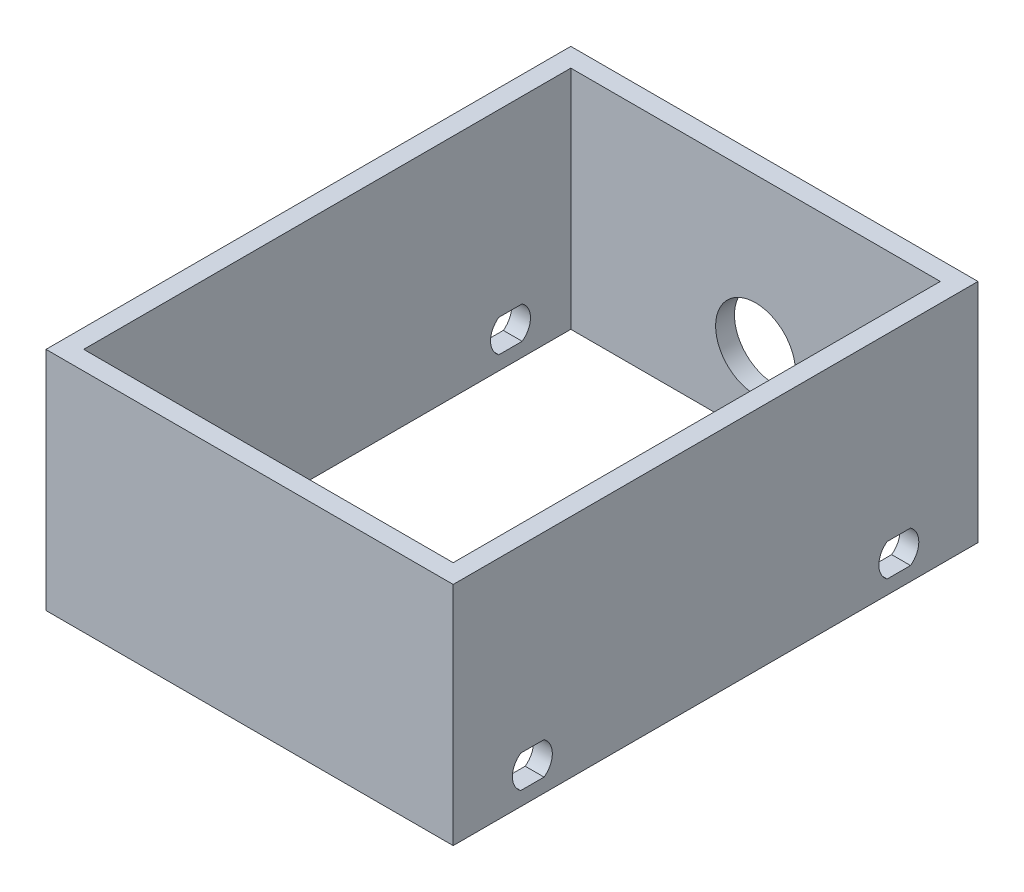
ISO-10303-21;
HEADER;
FILE_DESCRIPTION(('STEP AP214'),'2;1');
FILE_NAME('part.step','',(''),(''),'','','');
FILE_SCHEMA(('AUTOMOTIVE_DESIGN { 1 0 10303 214 1 1 1 1 }'));
ENDSEC;
DATA;
#1=APPLICATION_CONTEXT('core data for automotive mechanical design processes');
#2=APPLICATION_PROTOCOL_DEFINITION('international standard','automotive_design',2000,#1);
#3=PRODUCT_CONTEXT('',#1,'mechanical');
#4=PRODUCT('Part','Part','',(#3));
#5=PRODUCT_RELATED_PRODUCT_CATEGORY('part','',(#4));
#6=PRODUCT_DEFINITION_FORMATION('','',#4);
#7=PRODUCT_DEFINITION_CONTEXT('part definition',#1,'design');
#8=PRODUCT_DEFINITION('design','',#6,#7);
#9=PRODUCT_DEFINITION_SHAPE('','',#8);
#10=(LENGTH_UNIT() NAMED_UNIT(*) SI_UNIT(.MILLI.,.METRE.));
#11=(NAMED_UNIT(*) PLANE_ANGLE_UNIT() SI_UNIT($,.RADIAN.));
#12=(NAMED_UNIT(*) SI_UNIT($,.STERADIAN.) SOLID_ANGLE_UNIT());
#13=UNCERTAINTY_MEASURE_WITH_UNIT(LENGTH_MEASURE(1.E-05),#10,'distance_accuracy_value','');
#14=(GEOMETRIC_REPRESENTATION_CONTEXT(3) GLOBAL_UNCERTAINTY_ASSIGNED_CONTEXT((#13)) GLOBAL_UNIT_ASSIGNED_CONTEXT((#10,
#11,#12)) REPRESENTATION_CONTEXT('',''));
#15=CARTESIAN_POINT('',(0.,0.,0.));
#16=DIRECTION('',(0.,0.,1.));
#17=DIRECTION('',(1.,0.,0.));
#18=AXIS2_PLACEMENT_3D('',#15,#16,#17);
#19=CARTESIAN_POINT('',(27.,20.,-34.8));
#20=DIRECTION('',(0.,0.,1.));
#21=DIRECTION('',(1.,0.,0.));
#22=AXIS2_PLACEMENT_3D('',#19,#20,#21);
#23=PLANE('',#22);
#24=DIRECTION('',(-1.,0.,0.));
#25=VECTOR('',#24,1.);
#26=CARTESIAN_POINT('',(27.,0.,-34.8));
#27=LINE('',#26,#25);
#28=CARTESIAN_POINT('',(27.,0.,-34.8));
#29=VERTEX_POINT('',#28);
#30=CARTESIAN_POINT('',(-27.,0.,-34.8));
#31=VERTEX_POINT('',#30);
#32=EDGE_CURVE('E376',#29,#31,#27,.T.);
#33=ORIENTED_EDGE('',*,*,#32,.T.);
#34=DIRECTION('',(0.,-1.,0.));
#35=VECTOR('',#34,1.);
#36=CARTESIAN_POINT('',(-27.,20.,-34.8));
#37=LINE('',#36,#35);
#38=CARTESIAN_POINT('',(-27.,30.,-34.8));
#39=VERTEX_POINT('',#38);
#40=EDGE_CURVE('E384',#39,#31,#37,.T.);
#41=ORIENTED_EDGE('',*,*,#40,.F.);
#42=DIRECTION('',(-1.,0.,0.));
#43=VECTOR('',#42,1.);
#44=CARTESIAN_POINT('',(27.,30.,-34.8));
#45=LINE('',#44,#43);
#46=CARTESIAN_POINT('',(27.,30.,-34.8));
#47=VERTEX_POINT('',#46);
#48=EDGE_CURVE('E353',#47,#39,#45,.T.);
#49=ORIENTED_EDGE('',*,*,#48,.F.);
#50=DIRECTION('',(0.,-1.,0.));
#51=VECTOR('',#50,1.);
#52=CARTESIAN_POINT('',(27.,20.,-34.8));
#53=LINE('',#52,#51);
#54=EDGE_CURVE('E387',#47,#29,#53,.T.);
#55=ORIENTED_EDGE('',*,*,#54,.T.);
#56=EDGE_LOOP('',(#33,#41,#49,#55));
#57=FACE_BOUND('',#56,.T.);
#58=CARTESIAN_POINT('',(0.,10.,-34.8));
#59=DIRECTION('',(0.,0.,1.));
#60=DIRECTION('',(1.,0.,0.));
#61=AXIS2_PLACEMENT_3D('',#58,#59,#60);
#62=CIRCLE('',#61,5.3);
#63=CARTESIAN_POINT('',(5.3,10.,-34.8));
#64=VERTEX_POINT('',#63);
#65=EDGE_CURVE('E321',#64,#64,#62,.T.);
#66=ORIENTED_EDGE('',*,*,#65,.T.);
#67=EDGE_LOOP('',(#66));
#68=FACE_BOUND('',#67,.T.);
#69=ADVANCED_FACE('F53',(#57,#68),#23,.F.);
#70=CARTESIAN_POINT('',(24.5,-82.4824829888141,-32.3));
#71=DIRECTION('',(0.,0.,-1.));
#72=DIRECTION('',(-1.,0.,0.));
#73=AXIS2_PLACEMENT_3D('',#70,#71,#72);
#74=PLANE('',#73);
#75=DIRECTION('',(-1.,0.,0.));
#76=VECTOR('',#75,1.);
#77=CARTESIAN_POINT('',(24.5,0.,-32.3));
#78=LINE('',#77,#76);
#79=CARTESIAN_POINT('',(24.5,0.,-32.3));
#80=VERTEX_POINT('',#79);
#81=CARTESIAN_POINT('',(-24.5,0.,-32.3));
#82=VERTEX_POINT('',#81);
#83=EDGE_CURVE('E347',#80,#82,#78,.T.);
#84=ORIENTED_EDGE('',*,*,#83,.F.);
#85=DIRECTION('',(0.,1.,0.));
#86=VECTOR('',#85,1.);
#87=CARTESIAN_POINT('',(24.5,-82.4824829888141,-32.3));
#88=LINE('',#87,#86);
#89=CARTESIAN_POINT('',(24.5,30.,-32.3));
#90=VERTEX_POINT('',#89);
#91=EDGE_CURVE('E336',#80,#90,#88,.T.);
#92=ORIENTED_EDGE('',*,*,#91,.T.);
#93=DIRECTION('',(-1.,0.,0.));
#94=VECTOR('',#93,1.);
#95=CARTESIAN_POINT('',(24.5,30.,-32.3));
#96=LINE('',#95,#94);
#97=CARTESIAN_POINT('',(-24.5,30.,-32.3));
#98=VERTEX_POINT('',#97);
#99=EDGE_CURVE('E337',#90,#98,#96,.T.);
#100=ORIENTED_EDGE('',*,*,#99,.T.);
#101=DIRECTION('',(0.,1.,0.));
#102=VECTOR('',#101,1.);
#103=CARTESIAN_POINT('',(-24.5,-82.4824829888141,-32.3));
#104=LINE('',#103,#102);
#105=EDGE_CURVE('E331',#82,#98,#104,.T.);
#106=ORIENTED_EDGE('',*,*,#105,.F.);
#107=EDGE_LOOP('',(#84,#92,#100,#106));
#108=FACE_BOUND('',#107,.T.);
#109=CARTESIAN_POINT('',(0.,10.,-32.3));
#110=DIRECTION('',(0.,0.,-1.));
#111=DIRECTION('',(-1.,0.,0.));
#112=AXIS2_PLACEMENT_3D('',#109,#110,#111);
#113=CIRCLE('',#112,5.3);
#114=CARTESIAN_POINT('',(-5.3,10.,-32.3));
#115=VERTEX_POINT('',#114);
#116=EDGE_CURVE('E322',#115,#115,#113,.T.);
#117=ORIENTED_EDGE('',*,*,#116,.T.);
#118=EDGE_LOOP('',(#117));
#119=FACE_BOUND('',#118,.T.);
#120=ADVANCED_FACE('F428',(#108,#119),#74,.F.);
#121=CARTESIAN_POINT('',(27.,0.,34.8));
#122=DIRECTION('',(0.,-1.,0.));
#123=DIRECTION('',(0.,0.,-1.));
#124=AXIS2_PLACEMENT_3D('',#121,#122,#123);
#125=PLANE('',#124);
#126=DIRECTION('',(1.,0.,0.));
#127=VECTOR('',#126,1.);
#128=CARTESIAN_POINT('',(-27.,0.,34.8));
#129=LINE('',#128,#127);
#130=CARTESIAN_POINT('',(-27.,0.,34.8));
#131=VERTEX_POINT('',#130);
#132=CARTESIAN_POINT('',(27.,0.,34.8));
#133=VERTEX_POINT('',#132);
#134=EDGE_CURVE('E371',#131,#133,#129,.T.);
#135=ORIENTED_EDGE('',*,*,#134,.F.);
#136=DIRECTION('',(0.,0.,1.));
#137=VECTOR('',#136,1.);
#138=CARTESIAN_POINT('',(-27.,0.,0.));
#139=LINE('',#138,#137);
#140=EDGE_CURVE('E379',#31,#131,#139,.T.);
#141=ORIENTED_EDGE('',*,*,#140,.F.);
#142=ORIENTED_EDGE('',*,*,#32,.F.);
#143=DIRECTION('',(0.,0.,-1.));
#144=VECTOR('',#143,1.);
#145=CARTESIAN_POINT('',(27.,0.,0.));
#146=LINE('',#145,#144);
#147=EDGE_CURVE('E374',#133,#29,#146,.T.);
#148=ORIENTED_EDGE('',*,*,#147,.F.);
#149=EDGE_LOOP('',(#135,#141,#142,#148));
#150=FACE_BOUND('',#149,.T.);
#151=DIRECTION('',(1.,0.,0.));
#152=VECTOR('',#151,1.);
#153=CARTESIAN_POINT('',(-24.5,0.,32.3));
#154=LINE('',#153,#152);
#155=CARTESIAN_POINT('',(-24.5,0.,32.3));
#156=VERTEX_POINT('',#155);
#157=CARTESIAN_POINT('',(24.5,0.,32.3));
#158=VERTEX_POINT('',#157);
#159=EDGE_CURVE('E340',#156,#158,#154,.T.);
#160=ORIENTED_EDGE('',*,*,#159,.T.);
#161=DIRECTION('',(0.,0.,-1.));
#162=VECTOR('',#161,1.);
#163=CARTESIAN_POINT('',(24.5,0.,32.3));
#164=LINE('',#163,#162);
#165=EDGE_CURVE('E344',#158,#80,#164,.T.);
#166=ORIENTED_EDGE('',*,*,#165,.T.);
#167=ORIENTED_EDGE('',*,*,#83,.T.);
#168=DIRECTION('',(0.,0.,1.));
#169=VECTOR('',#168,1.);
#170=CARTESIAN_POINT('',(-24.5,0.,-32.3));
#171=LINE('',#170,#169);
#172=EDGE_CURVE('E350',#82,#156,#171,.T.);
#173=ORIENTED_EDGE('',*,*,#172,.T.);
#174=EDGE_LOOP('',(#160,#166,#167,#173));
#175=FACE_BOUND('',#174,.T.);
#176=ADVANCED_FACE('F434',(#150,#175),#125,.T.);
#177=CARTESIAN_POINT('',(-27.,20.,34.8));
#178=DIRECTION('',(0.,0.,-1.));
#179=DIRECTION('',(-1.,0.,0.));
#180=AXIS2_PLACEMENT_3D('',#177,#178,#179);
#181=PLANE('',#180);
#182=ORIENTED_EDGE('',*,*,#134,.T.);
#183=DIRECTION('',(0.,-1.,0.));
#184=VECTOR('',#183,1.);
#185=CARTESIAN_POINT('',(27.,20.,34.8));
#186=LINE('',#185,#184);
#187=CARTESIAN_POINT('',(27.,30.,34.8));
#188=VERTEX_POINT('',#187);
#189=EDGE_CURVE('E390',#188,#133,#186,.T.);
#190=ORIENTED_EDGE('',*,*,#189,.F.);
#191=DIRECTION('',(1.,0.,0.));
#192=VECTOR('',#191,1.);
#193=CARTESIAN_POINT('',(-27.,30.,34.8));
#194=LINE('',#193,#192);
#195=CARTESIAN_POINT('',(-27.,30.,34.8));
#196=VERTEX_POINT('',#195);
#197=EDGE_CURVE('E365',#196,#188,#194,.T.);
#198=ORIENTED_EDGE('',*,*,#197,.F.);
#199=DIRECTION('',(0.,-1.,0.));
#200=VECTOR('',#199,1.);
#201=CARTESIAN_POINT('',(-27.,20.,34.8));
#202=LINE('',#201,#200);
#203=EDGE_CURVE('E381',#196,#131,#202,.T.);
#204=ORIENTED_EDGE('',*,*,#203,.T.);
#205=EDGE_LOOP('',(#182,#190,#198,#204));
#206=FACE_BOUND('',#205,.T.);
#207=ADVANCED_FACE('F55',(#206),#181,.F.);
#208=CARTESIAN_POINT('',(27.,20.,0.));
#209=DIRECTION('',(-1.,0.,0.));
#210=DIRECTION('',(0.,0.,1.));
#211=AXIS2_PLACEMENT_3D('',#208,#209,#210);
#212=PLANE('',#211);
#213=DIRECTION('',(0.,0.,-1.));
#214=VECTOR('',#213,1.);
#215=CARTESIAN_POINT('',(27.,6.15,0.));
#216=LINE('',#215,#214);
#217=CARTESIAN_POINT('',(27.,6.15,-22.750806661517));
#218=VERTEX_POINT('',#217);
#219=CARTESIAN_POINT('',(27.,6.15,-25.849193338483));
#220=VERTEX_POINT('',#219);
#221=EDGE_CURVE('E264',#218,#220,#216,.T.);
#222=ORIENTED_EDGE('',*,*,#221,.T.);
#223=CARTESIAN_POINT('',(27.,4.,-24.3));
#224=DIRECTION('',(-1.,0.,0.));
#225=DIRECTION('',(0.,0.,1.));
#226=AXIS2_PLACEMENT_3D('',#223,#224,#225);
#227=CIRCLE('',#226,2.65);
#228=CARTESIAN_POINT('',(27.,1.85,-25.849193338483));
#229=VERTEX_POINT('',#228);
#230=EDGE_CURVE('E270',#220,#229,#227,.T.);
#231=ORIENTED_EDGE('',*,*,#230,.T.);
#232=DIRECTION('',(0.,0.,1.));
#233=VECTOR('',#232,1.);
#234=CARTESIAN_POINT('',(27.,1.85,0.));
#235=LINE('',#234,#233);
#236=CARTESIAN_POINT('',(27.,1.85,-22.750806661517));
#237=VERTEX_POINT('',#236);
#238=EDGE_CURVE('E252',#229,#237,#235,.T.);
#239=ORIENTED_EDGE('',*,*,#238,.T.);
#240=CARTESIAN_POINT('',(27.,4.,-24.3));
#241=DIRECTION('',(-1.,0.,0.));
#242=DIRECTION('',(0.,0.,1.));
#243=AXIS2_PLACEMENT_3D('',#240,#241,#242);
#244=CIRCLE('',#243,2.65);
#245=EDGE_CURVE('E258',#237,#218,#244,.T.);
#246=ORIENTED_EDGE('',*,*,#245,.T.);
#247=EDGE_LOOP('',(#222,#231,#239,#246));
#248=FACE_BOUND('',#247,.T.);
#249=DIRECTION('',(0.,0.,-1.));
#250=VECTOR('',#249,1.);
#251=CARTESIAN_POINT('',(27.,6.15,0.));
#252=LINE('',#251,#250);
#253=CARTESIAN_POINT('',(27.,6.15,25.849193338483));
#254=VERTEX_POINT('',#253);
#255=CARTESIAN_POINT('',(27.,6.15,22.750806661517));
#256=VERTEX_POINT('',#255);
#257=EDGE_CURVE('E312',#254,#256,#252,.T.);
#258=ORIENTED_EDGE('',*,*,#257,.T.);
#259=CARTESIAN_POINT('',(27.,4.,24.3));
#260=DIRECTION('',(-1.,0.,0.));
#261=DIRECTION('',(0.,0.,1.));
#262=AXIS2_PLACEMENT_3D('',#259,#260,#261);
#263=CIRCLE('',#262,2.65);
#264=CARTESIAN_POINT('',(27.,1.85,22.750806661517));
#265=VERTEX_POINT('',#264);
#266=EDGE_CURVE('E318',#256,#265,#263,.T.);
#267=ORIENTED_EDGE('',*,*,#266,.T.);
#268=DIRECTION('',(0.,0.,1.));
#269=VECTOR('',#268,1.);
#270=CARTESIAN_POINT('',(27.,1.85,0.));
#271=LINE('',#270,#269);
#272=CARTESIAN_POINT('',(27.,1.85,25.849193338483));
#273=VERTEX_POINT('',#272);
#274=EDGE_CURVE('E300',#265,#273,#271,.T.);
#275=ORIENTED_EDGE('',*,*,#274,.T.);
#276=CARTESIAN_POINT('',(27.,4.,24.3));
#277=DIRECTION('',(-1.,0.,0.));
#278=DIRECTION('',(0.,0.,1.));
#279=AXIS2_PLACEMENT_3D('',#276,#277,#278);
#280=CIRCLE('',#279,2.65);
#281=EDGE_CURVE('E306',#273,#254,#280,.T.);
#282=ORIENTED_EDGE('',*,*,#281,.T.);
#283=EDGE_LOOP('',(#258,#267,#275,#282));
#284=FACE_BOUND('',#283,.T.);
#285=ORIENTED_EDGE('',*,*,#147,.T.);
#286=ORIENTED_EDGE('',*,*,#54,.F.);
#287=DIRECTION('',(0.,0.,-1.));
#288=VECTOR('',#287,1.);
#289=CARTESIAN_POINT('',(27.,30.,34.8));
#290=LINE('',#289,#288);
#291=EDGE_CURVE('E368',#188,#47,#290,.T.);
#292=ORIENTED_EDGE('',*,*,#291,.F.);
#293=ORIENTED_EDGE('',*,*,#189,.T.);
#294=EDGE_LOOP('',(#285,#286,#292,#293));
#295=FACE_BOUND('',#294,.T.);
#296=ADVANCED_FACE('F440',(#248,#284,#295),#212,.F.);
#297=CARTESIAN_POINT('',(-27.,20.,0.));
#298=DIRECTION('',(1.,0.,0.));
#299=DIRECTION('',(0.,0.,-1.));
#300=AXIS2_PLACEMENT_3D('',#297,#298,#299);
#301=PLANE('',#300);
#302=DIRECTION('',(0.,0.,1.));
#303=VECTOR('',#302,1.);
#304=CARTESIAN_POINT('',(-27.,1.85,-25.849193338483));
#305=LINE('',#304,#303);
#306=CARTESIAN_POINT('',(-27.,1.85,-25.849193338483));
#307=VERTEX_POINT('',#306);
#308=CARTESIAN_POINT('',(-27.,1.85,-22.750806661517));
#309=VERTEX_POINT('',#308);
#310=EDGE_CURVE('E229',#307,#309,#305,.T.);
#311=ORIENTED_EDGE('',*,*,#310,.F.);
#312=CARTESIAN_POINT('',(-27.,4.,-24.3));
#313=DIRECTION('',(-1.,0.,0.));
#314=DIRECTION('',(0.,0.,1.));
#315=AXIS2_PLACEMENT_3D('',#312,#313,#314);
#316=CIRCLE('',#315,2.65);
#317=CARTESIAN_POINT('',(-27.,6.15,-25.849193338483));
#318=VERTEX_POINT('',#317);
#319=EDGE_CURVE('E76',#318,#307,#316,.T.);
#320=ORIENTED_EDGE('',*,*,#319,.F.);
#321=DIRECTION('',(0.,0.,-1.));
#322=VECTOR('',#321,1.);
#323=CARTESIAN_POINT('',(-27.,6.15,-25.849193338483));
#324=LINE('',#323,#322);
#325=CARTESIAN_POINT('',(-27.,6.15,-22.750806661517));
#326=VERTEX_POINT('',#325);
#327=EDGE_CURVE('E237',#326,#318,#324,.T.);
#328=ORIENTED_EDGE('',*,*,#327,.F.);
#329=CARTESIAN_POINT('',(-27.,4.,-24.3));
#330=DIRECTION('',(-1.,0.,0.));
#331=DIRECTION('',(0.,0.,1.));
#332=AXIS2_PLACEMENT_3D('',#329,#330,#331);
#333=CIRCLE('',#332,2.65);
#334=EDGE_CURVE('E220',#309,#326,#333,.T.);
#335=ORIENTED_EDGE('',*,*,#334,.F.);
#336=EDGE_LOOP('',(#311,#320,#328,#335));
#337=FACE_BOUND('',#336,.T.);
#338=DIRECTION('',(0.,0.,1.));
#339=VECTOR('',#338,1.);
#340=CARTESIAN_POINT('',(-27.,1.85,22.750806661517));
#341=LINE('',#340,#339);
#342=CARTESIAN_POINT('',(-27.,1.85,22.750806661517));
#343=VERTEX_POINT('',#342);
#344=CARTESIAN_POINT('',(-27.,1.85,25.849193338483));
#345=VERTEX_POINT('',#344);
#346=EDGE_CURVE('E275',#343,#345,#341,.T.);
#347=ORIENTED_EDGE('',*,*,#346,.F.);
#348=CARTESIAN_POINT('',(-27.,4.,24.3));
#349=DIRECTION('',(-1.,0.,0.));
#350=DIRECTION('',(0.,0.,1.));
#351=AXIS2_PLACEMENT_3D('',#348,#349,#350);
#352=CIRCLE('',#351,2.65);
#353=CARTESIAN_POINT('',(-27.,6.15,22.750806661517));
#354=VERTEX_POINT('',#353);
#355=EDGE_CURVE('E273',#354,#343,#352,.T.);
#356=ORIENTED_EDGE('',*,*,#355,.F.);
#357=DIRECTION('',(0.,0.,-1.));
#358=VECTOR('',#357,1.);
#359=CARTESIAN_POINT('',(-27.,6.15,22.750806661517));
#360=LINE('',#359,#358);
#361=CARTESIAN_POINT('',(-27.,6.15,25.849193338483));
#362=VERTEX_POINT('',#361);
#363=EDGE_CURVE('E281',#362,#354,#360,.T.);
#364=ORIENTED_EDGE('',*,*,#363,.F.);
#365=CARTESIAN_POINT('',(-27.,4.,24.3));
#366=DIRECTION('',(-1.,0.,0.));
#367=DIRECTION('',(0.,0.,1.));
#368=AXIS2_PLACEMENT_3D('',#365,#366,#367);
#369=CIRCLE('',#368,2.65);
#370=EDGE_CURVE('E278',#345,#362,#369,.T.);
#371=ORIENTED_EDGE('',*,*,#370,.F.);
#372=EDGE_LOOP('',(#347,#356,#364,#371));
#373=FACE_BOUND('',#372,.T.);
#374=ORIENTED_EDGE('',*,*,#140,.T.);
#375=ORIENTED_EDGE('',*,*,#203,.F.);
#376=DIRECTION('',(0.,0.,1.));
#377=VECTOR('',#376,1.);
#378=CARTESIAN_POINT('',(-27.,30.,-34.8));
#379=LINE('',#378,#377);
#380=EDGE_CURVE('E362',#39,#196,#379,.T.);
#381=ORIENTED_EDGE('',*,*,#380,.F.);
#382=ORIENTED_EDGE('',*,*,#40,.T.);
#383=EDGE_LOOP('',(#374,#375,#381,#382));
#384=FACE_BOUND('',#383,.T.);
#385=ADVANCED_FACE('F234',(#337,#373,#384),#301,.F.);
#386=CARTESIAN_POINT('',(-27.,30.,-34.8));
#387=DIRECTION('',(0.,1.,0.));
#388=DIRECTION('',(0.,0.,1.));
#389=AXIS2_PLACEMENT_3D('',#386,#387,#388);
#390=PLANE('',#389);
#391=ORIENTED_EDGE('',*,*,#48,.T.);
#392=ORIENTED_EDGE('',*,*,#380,.T.);
#393=ORIENTED_EDGE('',*,*,#197,.T.);
#394=ORIENTED_EDGE('',*,*,#291,.T.);
#395=EDGE_LOOP('',(#391,#392,#393,#394));
#396=FACE_BOUND('',#395,.T.);
#397=DIRECTION('',(0.,0.,-1.));
#398=VECTOR('',#397,1.);
#399=CARTESIAN_POINT('',(24.5,30.,32.3));
#400=LINE('',#399,#398);
#401=CARTESIAN_POINT('',(24.5,30.,32.3));
#402=VERTEX_POINT('',#401);
#403=EDGE_CURVE('E341',#402,#90,#400,.T.);
#404=ORIENTED_EDGE('',*,*,#403,.F.);
#405=DIRECTION('',(1.,0.,0.));
#406=VECTOR('',#405,1.);
#407=CARTESIAN_POINT('',(-24.5,30.,32.3));
#408=LINE('',#407,#406);
#409=CARTESIAN_POINT('',(-24.5,30.,32.3));
#410=VERTEX_POINT('',#409);
#411=EDGE_CURVE('E328',#410,#402,#408,.T.);
#412=ORIENTED_EDGE('',*,*,#411,.F.);
#413=DIRECTION('',(0.,0.,1.));
#414=VECTOR('',#413,1.);
#415=CARTESIAN_POINT('',(-24.5,30.,-32.3));
#416=LINE('',#415,#414);
#417=EDGE_CURVE('E333',#98,#410,#416,.T.);
#418=ORIENTED_EDGE('',*,*,#417,.F.);
#419=ORIENTED_EDGE('',*,*,#99,.F.);
#420=EDGE_LOOP('',(#404,#412,#418,#419));
#421=FACE_BOUND('',#420,.T.);
#422=ADVANCED_FACE('F447',(#396,#421),#390,.T.);
#423=CARTESIAN_POINT('',(24.5,-82.4824829888141,32.3));
#424=DIRECTION('',(1.,0.,0.));
#425=DIRECTION('',(0.,0.,-1.));
#426=AXIS2_PLACEMENT_3D('',#423,#424,#425);
#427=PLANE('',#426);
#428=DIRECTION('',(0.,0.,-1.));
#429=VECTOR('',#428,1.);
#430=CARTESIAN_POINT('',(24.5,1.85,32.3));
#431=LINE('',#430,#429);
#432=CARTESIAN_POINT('',(24.5,1.85,-22.750806661517));
#433=VERTEX_POINT('',#432);
#434=CARTESIAN_POINT('',(24.5,1.85,-25.849193338483));
#435=VERTEX_POINT('',#434);
#436=EDGE_CURVE('E249',#433,#435,#431,.T.);
#437=ORIENTED_EDGE('',*,*,#436,.T.);
#438=CARTESIAN_POINT('',(24.5,4.,-24.3));
#439=DIRECTION('',(1.,0.,0.));
#440=DIRECTION('',(0.,0.,-1.));
#441=AXIS2_PLACEMENT_3D('',#438,#439,#440);
#442=CIRCLE('',#441,2.65);
#443=CARTESIAN_POINT('',(24.5,6.15,-25.849193338483));
#444=VERTEX_POINT('',#443);
#445=EDGE_CURVE('E267',#435,#444,#442,.T.);
#446=ORIENTED_EDGE('',*,*,#445,.T.);
#447=DIRECTION('',(0.,0.,1.));
#448=VECTOR('',#447,1.);
#449=CARTESIAN_POINT('',(24.5,6.15,32.3));
#450=LINE('',#449,#448);
#451=CARTESIAN_POINT('',(24.5,6.15,-22.750806661517));
#452=VERTEX_POINT('',#451);
#453=EDGE_CURVE('E261',#444,#452,#450,.T.);
#454=ORIENTED_EDGE('',*,*,#453,.T.);
#455=CARTESIAN_POINT('',(24.5,4.,-24.3));
#456=DIRECTION('',(1.,0.,0.));
#457=DIRECTION('',(0.,0.,-1.));
#458=AXIS2_PLACEMENT_3D('',#455,#456,#457);
#459=CIRCLE('',#458,2.65);
#460=EDGE_CURVE('E255',#452,#433,#459,.T.);
#461=ORIENTED_EDGE('',*,*,#460,.T.);
#462=EDGE_LOOP('',(#437,#446,#454,#461));
#463=FACE_BOUND('',#462,.T.);
#464=DIRECTION('',(0.,0.,-1.));
#465=VECTOR('',#464,1.);
#466=CARTESIAN_POINT('',(24.5,1.85,32.3));
#467=LINE('',#466,#465);
#468=CARTESIAN_POINT('',(24.5,1.85,25.849193338483));
#469=VERTEX_POINT('',#468);
#470=CARTESIAN_POINT('',(24.5,1.85,22.750806661517));
#471=VERTEX_POINT('',#470);
#472=EDGE_CURVE('E297',#469,#471,#467,.T.);
#473=ORIENTED_EDGE('',*,*,#472,.T.);
#474=CARTESIAN_POINT('',(24.5,4.,24.3));
#475=DIRECTION('',(1.,0.,0.));
#476=DIRECTION('',(0.,0.,-1.));
#477=AXIS2_PLACEMENT_3D('',#474,#475,#476);
#478=CIRCLE('',#477,2.65);
#479=CARTESIAN_POINT('',(24.5,6.15,22.750806661517));
#480=VERTEX_POINT('',#479);
#481=EDGE_CURVE('E315',#471,#480,#478,.T.);
#482=ORIENTED_EDGE('',*,*,#481,.T.);
#483=DIRECTION('',(0.,0.,1.));
#484=VECTOR('',#483,1.);
#485=CARTESIAN_POINT('',(24.5,6.15,32.3));
#486=LINE('',#485,#484);
#487=CARTESIAN_POINT('',(24.5,6.15,25.849193338483));
#488=VERTEX_POINT('',#487);
#489=EDGE_CURVE('E309',#480,#488,#486,.T.);
#490=ORIENTED_EDGE('',*,*,#489,.T.);
#491=CARTESIAN_POINT('',(24.5,4.,24.3));
#492=DIRECTION('',(1.,0.,0.));
#493=DIRECTION('',(0.,0.,-1.));
#494=AXIS2_PLACEMENT_3D('',#491,#492,#493);
#495=CIRCLE('',#494,2.65);
#496=EDGE_CURVE('E303',#488,#469,#495,.T.);
#497=ORIENTED_EDGE('',*,*,#496,.T.);
#498=EDGE_LOOP('',(#473,#482,#490,#497));
#499=FACE_BOUND('',#498,.T.);
#500=ORIENTED_EDGE('',*,*,#165,.F.);
#501=DIRECTION('',(0.,1.,0.));
#502=VECTOR('',#501,1.);
#503=CARTESIAN_POINT('',(24.5,-82.4824829888141,32.3));
#504=LINE('',#503,#502);
#505=EDGE_CURVE('E325',#158,#402,#504,.T.);
#506=ORIENTED_EDGE('',*,*,#505,.T.);
#507=ORIENTED_EDGE('',*,*,#403,.T.);
#508=ORIENTED_EDGE('',*,*,#91,.F.);
#509=EDGE_LOOP('',(#500,#506,#507,#508));
#510=FACE_BOUND('',#509,.T.);
#511=ADVANCED_FACE('F463',(#463,#499,#510),#427,.F.);
#512=CARTESIAN_POINT('',(-24.5,-82.4824829888141,32.3));
#513=DIRECTION('',(0.,0.,1.));
#514=DIRECTION('',(1.,0.,0.));
#515=AXIS2_PLACEMENT_3D('',#512,#513,#514);
#516=PLANE('',#515);
#517=ORIENTED_EDGE('',*,*,#159,.F.);
#518=DIRECTION('',(0.,1.,0.));
#519=VECTOR('',#518,1.);
#520=CARTESIAN_POINT('',(-24.5,-82.4824829888141,32.3));
#521=LINE('',#520,#519);
#522=EDGE_CURVE('E332',#156,#410,#521,.T.);
#523=ORIENTED_EDGE('',*,*,#522,.T.);
#524=ORIENTED_EDGE('',*,*,#411,.T.);
#525=ORIENTED_EDGE('',*,*,#505,.F.);
#526=EDGE_LOOP('',(#517,#523,#524,#525));
#527=FACE_BOUND('',#526,.T.);
#528=ADVANCED_FACE('F473',(#527),#516,.F.);
#529=CARTESIAN_POINT('',(-24.5,-82.4824829888141,-32.3));
#530=DIRECTION('',(-1.,0.,0.));
#531=DIRECTION('',(0.,0.,1.));
#532=AXIS2_PLACEMENT_3D('',#529,#530,#531);
#533=PLANE('',#532);
#534=DIRECTION('',(0.,0.,-1.));
#535=VECTOR('',#534,1.);
#536=CARTESIAN_POINT('',(-24.5,6.15,-32.3));
#537=LINE('',#536,#535);
#538=CARTESIAN_POINT('',(-24.5,6.15,-22.750806661517));
#539=VERTEX_POINT('',#538);
#540=CARTESIAN_POINT('',(-24.5,6.15,-25.849193338483));
#541=VERTEX_POINT('',#540);
#542=EDGE_CURVE('E61',#539,#541,#537,.T.);
#543=ORIENTED_EDGE('',*,*,#542,.T.);
#544=CARTESIAN_POINT('',(-24.5,4.,-24.3));
#545=DIRECTION('',(-1.,0.,0.));
#546=DIRECTION('',(0.,0.,1.));
#547=AXIS2_PLACEMENT_3D('',#544,#545,#546);
#548=CIRCLE('',#547,2.65);
#549=CARTESIAN_POINT('',(-24.5,1.85,-25.849193338483));
#550=VERTEX_POINT('',#549);
#551=EDGE_CURVE('E12',#541,#550,#548,.T.);
#552=ORIENTED_EDGE('',*,*,#551,.T.);
#553=DIRECTION('',(0.,0.,1.));
#554=VECTOR('',#553,1.);
#555=CARTESIAN_POINT('',(-24.5,1.85,-32.3));
#556=LINE('',#555,#554);
#557=CARTESIAN_POINT('',(-24.5,1.85,-22.750806661517));
#558=VERTEX_POINT('',#557);
#559=EDGE_CURVE('E405',#550,#558,#556,.T.);
#560=ORIENTED_EDGE('',*,*,#559,.T.);
#561=CARTESIAN_POINT('',(-24.5,4.,-24.3));
#562=DIRECTION('',(-1.,0.,0.));
#563=DIRECTION('',(0.,0.,1.));
#564=AXIS2_PLACEMENT_3D('',#561,#562,#563);
#565=CIRCLE('',#564,2.65);
#566=EDGE_CURVE('E223',#558,#539,#565,.T.);
#567=ORIENTED_EDGE('',*,*,#566,.T.);
#568=EDGE_LOOP('',(#543,#552,#560,#567));
#569=FACE_BOUND('',#568,.T.);
#570=DIRECTION('',(0.,0.,-1.));
#571=VECTOR('',#570,1.);
#572=CARTESIAN_POINT('',(-24.5,6.15,-32.3));
#573=LINE('',#572,#571);
#574=CARTESIAN_POINT('',(-24.5,6.15,25.849193338483));
#575=VERTEX_POINT('',#574);
#576=CARTESIAN_POINT('',(-24.5,6.15,22.750806661517));
#577=VERTEX_POINT('',#576);
#578=EDGE_CURVE('E399',#575,#577,#573,.T.);
#579=ORIENTED_EDGE('',*,*,#578,.T.);
#580=CARTESIAN_POINT('',(-24.5,4.,24.3));
#581=DIRECTION('',(-1.,0.,0.));
#582=DIRECTION('',(0.,0.,1.));
#583=AXIS2_PLACEMENT_3D('',#580,#581,#582);
#584=CIRCLE('',#583,2.65);
#585=CARTESIAN_POINT('',(-24.5,1.85,22.750806661517));
#586=VERTEX_POINT('',#585);
#587=EDGE_CURVE('E402',#577,#586,#584,.T.);
#588=ORIENTED_EDGE('',*,*,#587,.T.);
#589=DIRECTION('',(0.,0.,1.));
#590=VECTOR('',#589,1.);
#591=CARTESIAN_POINT('',(-24.5,1.85,-32.3));
#592=LINE('',#591,#590);
#593=CARTESIAN_POINT('',(-24.5,1.85,25.849193338483));
#594=VERTEX_POINT('',#593);
#595=EDGE_CURVE('E393',#586,#594,#592,.T.);
#596=ORIENTED_EDGE('',*,*,#595,.T.);
#597=CARTESIAN_POINT('',(-24.5,4.,24.3));
#598=DIRECTION('',(-1.,0.,0.));
#599=DIRECTION('',(0.,0.,1.));
#600=AXIS2_PLACEMENT_3D('',#597,#598,#599);
#601=CIRCLE('',#600,2.65);
#602=EDGE_CURVE('E396',#594,#575,#601,.T.);
#603=ORIENTED_EDGE('',*,*,#602,.T.);
#604=EDGE_LOOP('',(#579,#588,#596,#603));
#605=FACE_BOUND('',#604,.T.);
#606=ORIENTED_EDGE('',*,*,#172,.F.);
#607=ORIENTED_EDGE('',*,*,#105,.T.);
#608=ORIENTED_EDGE('',*,*,#417,.T.);
#609=ORIENTED_EDGE('',*,*,#522,.F.);
#610=EDGE_LOOP('',(#606,#607,#608,#609));
#611=FACE_BOUND('',#610,.T.);
#612=ADVANCED_FACE('F409',(#569,#605,#611),#533,.F.);
#613=CARTESIAN_POINT('',(0.,10.,-34.801));
#614=DIRECTION('',(0.,0.,1.));
#615=DIRECTION('',(1.,0.,0.));
#616=AXIS2_PLACEMENT_3D('',#613,#614,#615);
#617=CYLINDRICAL_SURFACE('',#616,5.3);
#618=ORIENTED_EDGE('',*,*,#116,.F.);
#619=EDGE_LOOP('',(#618));
#620=FACE_BOUND('',#619,.T.);
#621=ORIENTED_EDGE('',*,*,#65,.F.);
#622=EDGE_LOOP('',(#621));
#623=FACE_BOUND('',#622,.T.);
#624=ADVANCED_FACE('F488',(#620,#623),#617,.F.);
#625=CARTESIAN_POINT('',(43.,1.85,22.750806661517));
#626=DIRECTION('',(0.,-1.,0.));
#627=DIRECTION('',(0.,0.,-1.));
#628=AXIS2_PLACEMENT_3D('',#625,#626,#627);
#629=PLANE('',#628);
#630=DIRECTION('',(-1.,0.,0.));
#631=VECTOR('',#630,1.);
#632=CARTESIAN_POINT('',(43.,1.85,22.750806661517));
#633=LINE('',#632,#631);
#634=EDGE_CURVE('E284',#586,#343,#633,.T.);
#635=ORIENTED_EDGE('',*,*,#634,.T.);
#636=ORIENTED_EDGE('',*,*,#346,.T.);
#637=DIRECTION('',(-1.,0.,0.));
#638=VECTOR('',#637,1.);
#639=CARTESIAN_POINT('',(43.,1.85,25.849193338483));
#640=LINE('',#639,#638);
#641=EDGE_CURVE('E292',#594,#345,#640,.T.);
#642=ORIENTED_EDGE('',*,*,#641,.F.);
#643=ORIENTED_EDGE('',*,*,#595,.F.);
#644=EDGE_LOOP('',(#635,#636,#642,#643));
#645=FACE_BOUND('',#644,.T.);
#646=ADVANCED_FACE('F492',(#645),#629,.F.);
#647=CARTESIAN_POINT('',(43.,4.,24.3));
#648=DIRECTION('',(-1.,0.,0.));
#649=DIRECTION('',(0.,0.,1.));
#650=AXIS2_PLACEMENT_3D('',#647,#648,#649);
#651=CYLINDRICAL_SURFACE('',#650,2.65);
#652=ORIENTED_EDGE('',*,*,#641,.T.);
#653=ORIENTED_EDGE('',*,*,#370,.T.);
#654=DIRECTION('',(-1.,0.,0.));
#655=VECTOR('',#654,1.);
#656=CARTESIAN_POINT('',(43.,6.15,25.849193338483));
#657=LINE('',#656,#655);
#658=EDGE_CURVE('E289',#575,#362,#657,.T.);
#659=ORIENTED_EDGE('',*,*,#658,.F.);
#660=ORIENTED_EDGE('',*,*,#602,.F.);
#661=EDGE_LOOP('',(#652,#653,#659,#660));
#662=FACE_BOUND('',#661,.T.);
#663=ADVANCED_FACE('F507',(#662),#651,.F.);
#664=CARTESIAN_POINT('',(43.,6.15,22.750806661517));
#665=DIRECTION('',(0.,1.,0.));
#666=DIRECTION('',(0.,0.,1.));
#667=AXIS2_PLACEMENT_3D('',#664,#665,#666);
#668=PLANE('',#667);
#669=ORIENTED_EDGE('',*,*,#658,.T.);
#670=ORIENTED_EDGE('',*,*,#363,.T.);
#671=DIRECTION('',(-1.,0.,0.));
#672=VECTOR('',#671,1.);
#673=CARTESIAN_POINT('',(43.,6.15,22.750806661517));
#674=LINE('',#673,#672);
#675=EDGE_CURVE('E285',#577,#354,#674,.T.);
#676=ORIENTED_EDGE('',*,*,#675,.F.);
#677=ORIENTED_EDGE('',*,*,#578,.F.);
#678=EDGE_LOOP('',(#669,#670,#676,#677));
#679=FACE_BOUND('',#678,.T.);
#680=ADVANCED_FACE('F510',(#679),#668,.F.);
#681=CARTESIAN_POINT('',(43.,4.,24.3));
#682=DIRECTION('',(-1.,0.,0.));
#683=DIRECTION('',(0.,0.,1.));
#684=AXIS2_PLACEMENT_3D('',#681,#682,#683);
#685=CYLINDRICAL_SURFACE('',#684,2.65);
#686=ORIENTED_EDGE('',*,*,#675,.T.);
#687=ORIENTED_EDGE('',*,*,#355,.T.);
#688=ORIENTED_EDGE('',*,*,#634,.F.);
#689=ORIENTED_EDGE('',*,*,#587,.F.);
#690=EDGE_LOOP('',(#686,#687,#688,#689));
#691=FACE_BOUND('',#690,.T.);
#692=ADVANCED_FACE('F498',(#691),#685,.F.);
#693=EDGE_CURVE('E287',#256,#480,#674,.T.);
#694=ORIENTED_EDGE('',*,*,#693,.T.);
#695=ORIENTED_EDGE('',*,*,#481,.F.);
#696=EDGE_CURVE('E294',#265,#471,#633,.T.);
#697=ORIENTED_EDGE('',*,*,#696,.F.);
#698=ORIENTED_EDGE('',*,*,#266,.F.);
#699=EDGE_LOOP('',(#694,#695,#697,#698));
#700=FACE_BOUND('',#699,.T.);
#701=ADVANCED_FACE('F494',(#700),#685,.F.);
#702=EDGE_CURVE('E288',#254,#488,#657,.T.);
#703=ORIENTED_EDGE('',*,*,#702,.T.);
#704=ORIENTED_EDGE('',*,*,#489,.F.);
#705=ORIENTED_EDGE('',*,*,#693,.F.);
#706=ORIENTED_EDGE('',*,*,#257,.F.);
#707=EDGE_LOOP('',(#703,#704,#705,#706));
#708=FACE_BOUND('',#707,.T.);
#709=ADVANCED_FACE('F497',(#708),#668,.F.);
#710=EDGE_CURVE('E291',#273,#469,#640,.T.);
#711=ORIENTED_EDGE('',*,*,#710,.T.);
#712=ORIENTED_EDGE('',*,*,#496,.F.);
#713=ORIENTED_EDGE('',*,*,#702,.F.);
#714=ORIENTED_EDGE('',*,*,#281,.F.);
#715=EDGE_LOOP('',(#711,#712,#713,#714));
#716=FACE_BOUND('',#715,.T.);
#717=ADVANCED_FACE('F503',(#716),#651,.F.);
#718=ORIENTED_EDGE('',*,*,#696,.T.);
#719=ORIENTED_EDGE('',*,*,#472,.F.);
#720=ORIENTED_EDGE('',*,*,#710,.F.);
#721=ORIENTED_EDGE('',*,*,#274,.F.);
#722=EDGE_LOOP('',(#718,#719,#720,#721));
#723=FACE_BOUND('',#722,.T.);
#724=ADVANCED_FACE('F500',(#723),#629,.F.);
#725=CARTESIAN_POINT('',(43.,1.85,-25.849193338483));
#726=DIRECTION('',(0.,-1.,0.));
#727=DIRECTION('',(0.,0.,-1.));
#728=AXIS2_PLACEMENT_3D('',#725,#726,#727);
#729=PLANE('',#728);
#730=DIRECTION('',(-1.,0.,0.));
#731=VECTOR('',#730,1.);
#732=CARTESIAN_POINT('',(43.,1.85,-25.849193338483));
#733=LINE('',#732,#731);
#734=EDGE_CURVE('E231',#550,#307,#733,.T.);
#735=ORIENTED_EDGE('',*,*,#734,.T.);
#736=ORIENTED_EDGE('',*,*,#310,.T.);
#737=DIRECTION('',(-1.,0.,0.));
#738=VECTOR('',#737,1.);
#739=CARTESIAN_POINT('',(43.,1.85,-22.750806661517));
#740=LINE('',#739,#738);
#741=EDGE_CURVE('E215',#558,#309,#740,.T.);
#742=ORIENTED_EDGE('',*,*,#741,.F.);
#743=ORIENTED_EDGE('',*,*,#559,.F.);
#744=EDGE_LOOP('',(#735,#736,#742,#743));
#745=FACE_BOUND('',#744,.T.);
#746=ADVANCED_FACE('F230',(#745),#729,.F.);
#747=CARTESIAN_POINT('',(43.,4.,-24.3));
#748=DIRECTION('',(-1.,0.,0.));
#749=DIRECTION('',(0.,0.,1.));
#750=AXIS2_PLACEMENT_3D('',#747,#748,#749);
#751=CYLINDRICAL_SURFACE('',#750,2.65);
#752=ORIENTED_EDGE('',*,*,#741,.T.);
#753=ORIENTED_EDGE('',*,*,#334,.T.);
#754=DIRECTION('',(-1.,0.,0.));
#755=VECTOR('',#754,1.);
#756=CARTESIAN_POINT('',(43.,6.15,-22.750806661517));
#757=LINE('',#756,#755);
#758=EDGE_CURVE('E246',#539,#326,#757,.T.);
#759=ORIENTED_EDGE('',*,*,#758,.F.);
#760=ORIENTED_EDGE('',*,*,#566,.F.);
#761=EDGE_LOOP('',(#752,#753,#759,#760));
#762=FACE_BOUND('',#761,.T.);
#763=ADVANCED_FACE('F217',(#762),#751,.F.);
#764=CARTESIAN_POINT('',(43.,6.15,-25.849193338483));
#765=DIRECTION('',(0.,1.,0.));
#766=DIRECTION('',(0.,0.,1.));
#767=AXIS2_PLACEMENT_3D('',#764,#765,#766);
#768=PLANE('',#767);
#769=ORIENTED_EDGE('',*,*,#758,.T.);
#770=ORIENTED_EDGE('',*,*,#327,.T.);
#771=DIRECTION('',(-1.,0.,0.));
#772=VECTOR('',#771,1.);
#773=CARTESIAN_POINT('',(43.,6.15,-25.849193338483));
#774=LINE('',#773,#772);
#775=EDGE_CURVE('E242',#541,#318,#774,.T.);
#776=ORIENTED_EDGE('',*,*,#775,.F.);
#777=ORIENTED_EDGE('',*,*,#542,.F.);
#778=EDGE_LOOP('',(#769,#770,#776,#777));
#779=FACE_BOUND('',#778,.T.);
#780=ADVANCED_FACE('F413',(#779),#768,.F.);
#781=CARTESIAN_POINT('',(43.,4.,-24.3));
#782=DIRECTION('',(-1.,0.,0.));
#783=DIRECTION('',(0.,0.,1.));
#784=AXIS2_PLACEMENT_3D('',#781,#782,#783);
#785=CYLINDRICAL_SURFACE('',#784,2.65);
#786=ORIENTED_EDGE('',*,*,#775,.T.);
#787=ORIENTED_EDGE('',*,*,#319,.T.);
#788=ORIENTED_EDGE('',*,*,#734,.F.);
#789=ORIENTED_EDGE('',*,*,#551,.F.);
#790=EDGE_LOOP('',(#786,#787,#788,#789));
#791=FACE_BOUND('',#790,.T.);
#792=ADVANCED_FACE('F414',(#791),#785,.F.);
#793=EDGE_CURVE('E244',#220,#444,#774,.T.);
#794=ORIENTED_EDGE('',*,*,#793,.T.);
#795=ORIENTED_EDGE('',*,*,#445,.F.);
#796=EDGE_CURVE('E226',#229,#435,#733,.T.);
#797=ORIENTED_EDGE('',*,*,#796,.F.);
#798=ORIENTED_EDGE('',*,*,#230,.F.);
#799=EDGE_LOOP('',(#794,#795,#797,#798));
#800=FACE_BOUND('',#799,.T.);
#801=ADVANCED_FACE('F416',(#800),#785,.F.);
#802=EDGE_CURVE('E245',#218,#452,#757,.T.);
#803=ORIENTED_EDGE('',*,*,#802,.T.);
#804=ORIENTED_EDGE('',*,*,#453,.F.);
#805=ORIENTED_EDGE('',*,*,#793,.F.);
#806=ORIENTED_EDGE('',*,*,#221,.F.);
#807=EDGE_LOOP('',(#803,#804,#805,#806));
#808=FACE_BOUND('',#807,.T.);
#809=ADVANCED_FACE('F422',(#808),#768,.F.);
#810=EDGE_CURVE('E68',#237,#433,#740,.T.);
#811=ORIENTED_EDGE('',*,*,#810,.T.);
#812=ORIENTED_EDGE('',*,*,#460,.F.);
#813=ORIENTED_EDGE('',*,*,#802,.F.);
#814=ORIENTED_EDGE('',*,*,#245,.F.);
#815=EDGE_LOOP('',(#811,#812,#813,#814));
#816=FACE_BOUND('',#815,.T.);
#817=ADVANCED_FACE('F591',(#816),#751,.F.);
#818=ORIENTED_EDGE('',*,*,#796,.T.);
#819=ORIENTED_EDGE('',*,*,#436,.F.);
#820=ORIENTED_EDGE('',*,*,#810,.F.);
#821=ORIENTED_EDGE('',*,*,#238,.F.);
#822=EDGE_LOOP('',(#818,#819,#820,#821));
#823=FACE_BOUND('',#822,.T.);
#824=ADVANCED_FACE('F582',(#823),#729,.F.);
#825=CLOSED_SHELL('',(#69,#120,#176,#207,#296,#385,#422,#511,#528,#612,#624,#646,#663,#680,#692,
#701,#709,#717,#724,#746,#763,#780,#792,#801,#809,#817,#824));
#826=MANIFOLD_SOLID_BREP('B2',#825);
#827=ADVANCED_BREP_SHAPE_REPRESENTATION('',(#18,#826),#14);
#828=SHAPE_DEFINITION_REPRESENTATION(#9,#827);
ENDSEC;
END-ISO-10303-21;
